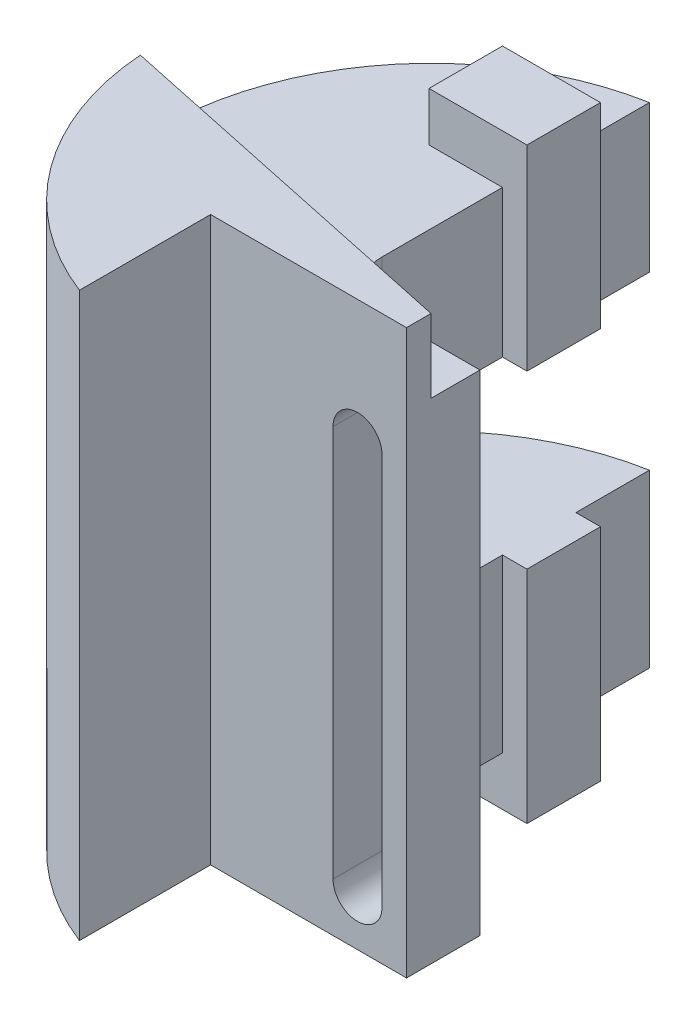
ISO-10303-21;
HEADER;
FILE_DESCRIPTION(('STEP AP214'),'2;1');
FILE_NAME('part.step','',(''),(''),'','','');
FILE_SCHEMA(('AUTOMOTIVE_DESIGN { 1 0 10303 214 1 1 1 1 }'));
ENDSEC;
DATA;
#1=APPLICATION_CONTEXT('core data for automotive mechanical design processes');
#2=APPLICATION_PROTOCOL_DEFINITION('international standard','automotive_design',2000,#1);
#3=PRODUCT_CONTEXT('',#1,'mechanical');
#4=PRODUCT('Part','Part','',(#3));
#5=PRODUCT_RELATED_PRODUCT_CATEGORY('part','',(#4));
#6=PRODUCT_DEFINITION_FORMATION('','',#4);
#7=PRODUCT_DEFINITION_CONTEXT('part definition',#1,'design');
#8=PRODUCT_DEFINITION('design','',#6,#7);
#9=PRODUCT_DEFINITION_SHAPE('','',#8);
#10=(LENGTH_UNIT() NAMED_UNIT(*) SI_UNIT(.MILLI.,.METRE.));
#11=(NAMED_UNIT(*) PLANE_ANGLE_UNIT() SI_UNIT($,.RADIAN.));
#12=(NAMED_UNIT(*) SI_UNIT($,.STERADIAN.) SOLID_ANGLE_UNIT());
#13=UNCERTAINTY_MEASURE_WITH_UNIT(LENGTH_MEASURE(1.E-05),#10,'distance_accuracy_value','');
#14=(GEOMETRIC_REPRESENTATION_CONTEXT(3) GLOBAL_UNCERTAINTY_ASSIGNED_CONTEXT((#13)) GLOBAL_UNIT_ASSIGNED_CONTEXT((#10,
#11,#12)) REPRESENTATION_CONTEXT('',''));
#15=CARTESIAN_POINT('',(0.,0.,0.));
#16=DIRECTION('',(0.,0.,1.));
#17=DIRECTION('',(1.,0.,0.));
#18=AXIS2_PLACEMENT_3D('',#15,#16,#17);
#19=CARTESIAN_POINT('',(0.,0.,0.));
#20=DIRECTION('',(0.,1.,0.));
#21=DIRECTION('',(0.,0.,1.));
#22=AXIS2_PLACEMENT_3D('',#19,#20,#21);
#23=PLANE('',#22);
#24=DIRECTION('',(1.,0.,0.));
#25=VECTOR('',#24,1.);
#26=CARTESIAN_POINT('',(-5.,0.,-39.5916660306315));
#27=LINE('',#26,#25);
#28=CARTESIAN_POINT('',(-25.,0.,-39.5916660306315));
#29=VERTEX_POINT('',#28);
#30=CARTESIAN_POINT('',(-10.,0.,-39.5916660306315));
#31=VERTEX_POINT('',#30);
#32=EDGE_CURVE('E59',#29,#31,#27,.T.);
#33=ORIENTED_EDGE('',*,*,#32,.F.);
#34=DIRECTION('',(0.,0.,-1.));
#35=VECTOR('',#34,1.);
#36=CARTESIAN_POINT('',(-25.,0.,-24.5916660306315));
#37=LINE('',#36,#35);
#38=CARTESIAN_POINT('',(-25.,0.,-24.5916660306315));
#39=VERTEX_POINT('',#38);
#40=EDGE_CURVE('E258',#39,#29,#37,.T.);
#41=ORIENTED_EDGE('',*,*,#40,.F.);
#42=DIRECTION('',(-1.,0.,0.));
#43=VECTOR('',#42,1.);
#44=CARTESIAN_POINT('',(-5.,0.,-24.5916660306315));
#45=LINE('',#44,#43);
#46=CARTESIAN_POINT('',(-10.,0.,-24.5916660306315));
#47=VERTEX_POINT('',#46);
#48=EDGE_CURVE('E11',#47,#39,#45,.T.);
#49=ORIENTED_EDGE('',*,*,#48,.F.);
#50=DIRECTION('',(0.,0.,-1.));
#51=VECTOR('',#50,1.);
#52=CARTESIAN_POINT('',(-10.,0.,-24.5916660306315));
#53=LINE('',#52,#51);
#54=CARTESIAN_POINT('',(-9.99999999999996,0.,0.));
#55=VERTEX_POINT('',#54);
#56=EDGE_CURVE('E382',#55,#47,#53,.T.);
#57=ORIENTED_EDGE('',*,*,#56,.F.);
#58=CARTESIAN_POINT('',(0.,0.,0.));
#59=DIRECTION('',(0.,-1.,0.));
#60=DIRECTION('',(0.,0.,1.));
#61=AXIS2_PLACEMENT_3D('',#58,#59,#60);
#62=CIRCLE('',#61,9.99999999999996);
#63=CARTESIAN_POINT('',(0.,0.,9.99999999999993));
#64=VERTEX_POINT('',#63);
#65=EDGE_CURVE('E406',#64,#55,#62,.T.);
#66=ORIENTED_EDGE('',*,*,#65,.F.);
#67=DIRECTION('',(-1.,0.,0.));
#68=VECTOR('',#67,1.);
#69=CARTESIAN_POINT('',(0.,0.,9.99999999999993));
#70=LINE('',#69,#68);
#71=CARTESIAN_POINT('',(20.,0.,10.));
#72=VERTEX_POINT('',#71);
#73=EDGE_CURVE('E404',#72,#64,#70,.T.);
#74=ORIENTED_EDGE('',*,*,#73,.F.);
#75=DIRECTION('',(0.,0.,-1.));
#76=VECTOR('',#75,1.);
#77=CARTESIAN_POINT('',(20.,0.,10.));
#78=LINE('',#77,#76);
#79=CARTESIAN_POINT('',(20.,0.,25.));
#80=VERTEX_POINT('',#79);
#81=EDGE_CURVE('E402',#80,#72,#78,.T.);
#82=ORIENTED_EDGE('',*,*,#81,.F.);
#83=DIRECTION('',(1.,0.,0.));
#84=VECTOR('',#83,1.);
#85=CARTESIAN_POINT('',(20.,0.,25.));
#86=LINE('',#85,#84);
#87=CARTESIAN_POINT('',(-20.,0.,25.));
#88=VERTEX_POINT('',#87);
#89=EDGE_CURVE('E400',#88,#80,#86,.T.);
#90=ORIENTED_EDGE('',*,*,#89,.F.);
#91=DIRECTION('',(0.,0.,-1.));
#92=VECTOR('',#91,1.);
#93=CARTESIAN_POINT('',(-20.,0.,25.));
#94=LINE('',#93,#92);
#95=CARTESIAN_POINT('',(-20.,0.,51.7711309515255));
#96=VERTEX_POINT('',#95);
#97=EDGE_CURVE('E398',#96,#88,#94,.T.);
#98=ORIENTED_EDGE('',*,*,#97,.F.);
#99=CARTESIAN_POINT('',(0.,0.,0.));
#100=DIRECTION('',(0.,1.,0.));
#101=DIRECTION('',(0.,0.,1.));
#102=AXIS2_PLACEMENT_3D('',#99,#100,#101);
#103=CIRCLE('',#102,55.5);
#104=CARTESIAN_POINT('',(-10.,0.,-54.5916660306315));
#105=VERTEX_POINT('',#104);
#106=EDGE_CURVE('E396',#105,#96,#103,.T.);
#107=ORIENTED_EDGE('',*,*,#106,.F.);
#108=DIRECTION('',(0.,0.,-1.));
#109=VECTOR('',#108,1.);
#110=CARTESIAN_POINT('',(-10.,0.,-54.5916660306315));
#111=LINE('',#110,#109);
#112=EDGE_CURVE('E378',#31,#105,#111,.T.);
#113=ORIENTED_EDGE('',*,*,#112,.F.);
#114=EDGE_LOOP('',(#33,#41,#49,#57,#66,#74,#82,#90,#98,#107,#113));
#115=FACE_BOUND('',#114,.T.);
#116=ADVANCED_FACE('F43',(#115),#23,.F.);
#117=CARTESIAN_POINT('',(0.,100.,0.));
#118=DIRECTION('',(0.,1.,0.));
#119=DIRECTION('',(0.,0.,1.));
#120=AXIS2_PLACEMENT_3D('',#117,#118,#119);
#121=PLANE('',#120);
#122=DIRECTION('',(0.,0.,1.));
#123=VECTOR('',#122,1.);
#124=CARTESIAN_POINT('',(-25.,100.,-39.5916660306315));
#125=LINE('',#124,#123);
#126=CARTESIAN_POINT('',(-25.,100.,-39.5916660306315));
#127=VERTEX_POINT('',#126);
#128=CARTESIAN_POINT('',(-25.,100.,-24.5916660306315));
#129=VERTEX_POINT('',#128);
#130=EDGE_CURVE('E268',#127,#129,#125,.T.);
#131=ORIENTED_EDGE('',*,*,#130,.F.);
#132=DIRECTION('',(1.,0.,0.));
#133=VECTOR('',#132,1.);
#134=CARTESIAN_POINT('',(0.,100.,-39.5916660306315));
#135=LINE('',#134,#133);
#136=CARTESIAN_POINT('',(-10.,100.,-39.5916660306315));
#137=VERTEX_POINT('',#136);
#138=EDGE_CURVE('E47',#127,#137,#135,.T.);
#139=ORIENTED_EDGE('',*,*,#138,.T.);
#140=DIRECTION('',(0.,0.,-1.));
#141=VECTOR('',#140,1.);
#142=CARTESIAN_POINT('',(-10.,100.,-54.5916660306315));
#143=LINE('',#142,#141);
#144=CARTESIAN_POINT('',(-10.,100.,-54.5916660306315));
#145=VERTEX_POINT('',#144);
#146=EDGE_CURVE('E379',#137,#145,#143,.T.);
#147=ORIENTED_EDGE('',*,*,#146,.T.);
#148=CARTESIAN_POINT('',(0.,100.,0.));
#149=DIRECTION('',(0.,1.,0.));
#150=DIRECTION('',(0.,0.,1.));
#151=AXIS2_PLACEMENT_3D('',#148,#149,#150);
#152=CIRCLE('',#151,55.5);
#153=CARTESIAN_POINT('',(-55.3569379835665,100.,3.98238836423228));
#154=VERTEX_POINT('',#153);
#155=EDGE_CURVE('E381',#145,#154,#152,.T.);
#156=ORIENTED_EDGE('',*,*,#155,.T.);
#157=DIRECTION('',(-0.978147600733806,0.,-0.207911690817756));
#158=VECTOR('',#157,1.);
#159=CARTESIAN_POINT('',(20.,100.,20.));
#160=LINE('',#159,#158);
#161=CARTESIAN_POINT('',(20.,100.,20.));
#162=VERTEX_POINT('',#161);
#163=EDGE_CURVE('E324',#162,#154,#160,.T.);
#164=ORIENTED_EDGE('',*,*,#163,.F.);
#165=DIRECTION('',(0.,0.,-1.));
#166=VECTOR('',#165,1.);
#167=CARTESIAN_POINT('',(20.,100.,10.));
#168=LINE('',#167,#166);
#169=CARTESIAN_POINT('',(20.,100.,10.));
#170=VERTEX_POINT('',#169);
#171=EDGE_CURVE('E384',#162,#170,#168,.T.);
#172=ORIENTED_EDGE('',*,*,#171,.T.);
#173=DIRECTION('',(-1.,0.,0.));
#174=VECTOR('',#173,1.);
#175=CARTESIAN_POINT('',(0.,100.,9.99999999999993));
#176=LINE('',#175,#174);
#177=CARTESIAN_POINT('',(0.,100.,9.99999999999993));
#178=VERTEX_POINT('',#177);
#179=EDGE_CURVE('E386',#170,#178,#176,.T.);
#180=ORIENTED_EDGE('',*,*,#179,.T.);
#181=CARTESIAN_POINT('',(0.,100.,0.));
#182=DIRECTION('',(0.,-1.,0.));
#183=DIRECTION('',(0.,0.,1.));
#184=AXIS2_PLACEMENT_3D('',#181,#182,#183);
#185=CIRCLE('',#184,9.99999999999996);
#186=CARTESIAN_POINT('',(-9.99999999999996,100.,0.));
#187=VERTEX_POINT('',#186);
#188=EDGE_CURVE('E388',#178,#187,#185,.T.);
#189=ORIENTED_EDGE('',*,*,#188,.T.);
#190=DIRECTION('',(0.,0.,-1.));
#191=VECTOR('',#190,1.);
#192=CARTESIAN_POINT('',(-10.,100.,-24.5916660306315));
#193=LINE('',#192,#191);
#194=CARTESIAN_POINT('',(-9.99999999999998,100.,-24.5916660306315));
#195=VERTEX_POINT('',#194);
#196=EDGE_CURVE('E390',#187,#195,#193,.T.);
#197=ORIENTED_EDGE('',*,*,#196,.T.);
#198=DIRECTION('',(1.,0.,0.));
#199=VECTOR('',#198,1.);
#200=CARTESIAN_POINT('',(-5.00000000000001,100.,-24.5916660306315));
#201=LINE('',#200,#199);
#202=EDGE_CURVE('E273',#129,#195,#201,.T.);
#203=ORIENTED_EDGE('',*,*,#202,.F.);
#204=EDGE_LOOP('',(#131,#139,#147,#156,#164,#172,#180,#189,#197,#203));
#205=FACE_BOUND('',#204,.T.);
#206=ADVANCED_FACE('F452',(#205),#121,.T.);
#207=CARTESIAN_POINT('',(-10.,100.,-39.5916660306315));
#208=DIRECTION('',(0.,0.,1.));
#209=DIRECTION('',(1.,0.,0.));
#210=AXIS2_PLACEMENT_3D('',#207,#208,#209);
#211=PLANE('',#210);
#212=DIRECTION('',(0.,-1.,0.));
#213=VECTOR('',#212,1.);
#214=CARTESIAN_POINT('',(-10.,100.,-39.5916660306315));
#215=LINE('',#214,#213);
#216=CARTESIAN_POINT('',(-10.,35.,-39.5916660306315));
#217=VERTEX_POINT('',#216);
#218=EDGE_CURVE('E439',#217,#31,#215,.T.);
#219=ORIENTED_EDGE('',*,*,#218,.F.);
#220=DIRECTION('',(1.,0.,0.));
#221=VECTOR('',#220,1.);
#222=CARTESIAN_POINT('',(-10.,35.,-39.5916660306315));
#223=LINE('',#222,#221);
#224=CARTESIAN_POINT('',(-5.00000000000001,35.,-39.5916660306315));
#225=VERTEX_POINT('',#224);
#226=EDGE_CURVE('E318',#217,#225,#223,.T.);
#227=ORIENTED_EDGE('',*,*,#226,.T.);
#228=DIRECTION('',(0.,-1.,0.));
#229=VECTOR('',#228,1.);
#230=CARTESIAN_POINT('',(-5.00000000000001,100.,-39.5916660306315));
#231=LINE('',#230,#229);
#232=CARTESIAN_POINT('',(-5.,-10.,-39.5916660306315));
#233=VERTEX_POINT('',#232);
#234=EDGE_CURVE('E393',#225,#233,#231,.T.);
#235=ORIENTED_EDGE('',*,*,#234,.T.);
#236=DIRECTION('',(1.,0.,0.));
#237=VECTOR('',#236,1.);
#238=CARTESIAN_POINT('',(-5.,-10.,-39.5916660306315));
#239=LINE('',#238,#237);
#240=CARTESIAN_POINT('',(-25.,-10.,-39.5916660306315));
#241=VERTEX_POINT('',#240);
#242=EDGE_CURVE('E256',#241,#233,#239,.T.);
#243=ORIENTED_EDGE('',*,*,#242,.F.);
#244=DIRECTION('',(0.,1.,0.));
#245=VECTOR('',#244,1.);
#246=CARTESIAN_POINT('',(-25.,-10.,-39.5916660306315));
#247=LINE('',#246,#245);
#248=EDGE_CURVE('E262',#241,#29,#247,.T.);
#249=ORIENTED_EDGE('',*,*,#248,.T.);
#250=ORIENTED_EDGE('',*,*,#32,.T.);
#251=EDGE_LOOP('',(#219,#227,#235,#243,#249,#250));
#252=FACE_BOUND('',#251,.T.);
#253=ADVANCED_FACE('F513',(#252),#211,.F.);
#254=CARTESIAN_POINT('',(-10.,100.,-54.5916660306315));
#255=DIRECTION('',(-1.,0.,0.));
#256=DIRECTION('',(0.,0.,1.));
#257=AXIS2_PLACEMENT_3D('',#254,#255,#256);
#258=PLANE('',#257);
#259=DIRECTION('',(0.,-1.,0.));
#260=VECTOR('',#259,1.);
#261=CARTESIAN_POINT('',(-10.,100.,-54.5916660306315));
#262=LINE('',#261,#260);
#263=CARTESIAN_POINT('',(-9.99999999999998,35.,-54.5916660306315));
#264=VERTEX_POINT('',#263);
#265=EDGE_CURVE('E435',#264,#105,#262,.T.);
#266=ORIENTED_EDGE('',*,*,#265,.F.);
#267=DIRECTION('',(0.,0.,1.));
#268=VECTOR('',#267,1.);
#269=CARTESIAN_POINT('',(-10.,35.,-54.5916660306315));
#270=LINE('',#269,#268);
#271=EDGE_CURVE('E315',#264,#217,#270,.T.);
#272=ORIENTED_EDGE('',*,*,#271,.T.);
#273=ORIENTED_EDGE('',*,*,#218,.T.);
#274=ORIENTED_EDGE('',*,*,#112,.T.);
#275=EDGE_LOOP('',(#266,#272,#273,#274));
#276=FACE_BOUND('',#275,.T.);
#277=ADVANCED_FACE('F511',(#276),#258,.F.);
#278=CARTESIAN_POINT('',(-5.,100.,-24.5916660306315));
#279=DIRECTION('',(0.,0.,-1.));
#280=DIRECTION('',(-1.,0.,0.));
#281=AXIS2_PLACEMENT_3D('',#278,#279,#280);
#282=PLANE('',#281);
#283=DIRECTION('',(0.,-1.,0.));
#284=VECTOR('',#283,1.);
#285=CARTESIAN_POINT('',(-5.,100.,-24.5916660306315));
#286=LINE('',#285,#284);
#287=CARTESIAN_POINT('',(-5.,35.,-24.5916660306315));
#288=VERTEX_POINT('',#287);
#289=CARTESIAN_POINT('',(-5.,-10.,-24.5916660306315));
#290=VERTEX_POINT('',#289);
#291=EDGE_CURVE('E232',#288,#290,#286,.T.);
#292=ORIENTED_EDGE('',*,*,#291,.F.);
#293=DIRECTION('',(-1.,0.,0.));
#294=VECTOR('',#293,1.);
#295=CARTESIAN_POINT('',(-5.,35.,-24.5916660306315));
#296=LINE('',#295,#294);
#297=CARTESIAN_POINT('',(-10.,35.,-24.5916660306315));
#298=VERTEX_POINT('',#297);
#299=EDGE_CURVE('E307',#288,#298,#296,.T.);
#300=ORIENTED_EDGE('',*,*,#299,.T.);
#301=DIRECTION('',(0.,-1.,0.));
#302=VECTOR('',#301,1.);
#303=CARTESIAN_POINT('',(-10.,100.,-24.5916660306315));
#304=LINE('',#303,#302);
#305=EDGE_CURVE('E413',#298,#47,#304,.T.);
#306=ORIENTED_EDGE('',*,*,#305,.T.);
#307=ORIENTED_EDGE('',*,*,#48,.T.);
#308=DIRECTION('',(0.,1.,0.));
#309=VECTOR('',#308,1.);
#310=CARTESIAN_POINT('',(-25.,-10.,-24.5916660306315));
#311=LINE('',#310,#309);
#312=CARTESIAN_POINT('',(-25.,-10.,-24.5916660306315));
#313=VERTEX_POINT('',#312);
#314=EDGE_CURVE('E248',#313,#39,#311,.T.);
#315=ORIENTED_EDGE('',*,*,#314,.F.);
#316=DIRECTION('',(-1.,0.,0.));
#317=VECTOR('',#316,1.);
#318=CARTESIAN_POINT('',(-5.,-10.,-24.5916660306315));
#319=LINE('',#318,#317);
#320=EDGE_CURVE('E245',#290,#313,#319,.T.);
#321=ORIENTED_EDGE('',*,*,#320,.F.);
#322=EDGE_LOOP('',(#292,#300,#306,#307,#315,#321));
#323=FACE_BOUND('',#322,.T.);
#324=ADVANCED_FACE('F246',(#323),#282,.F.);
#325=CARTESIAN_POINT('',(-5.00000000000001,100.,-39.5916660306315));
#326=DIRECTION('',(-1.,0.,0.));
#327=DIRECTION('',(0.,0.,1.));
#328=AXIS2_PLACEMENT_3D('',#325,#326,#327);
#329=PLANE('',#328);
#330=ORIENTED_EDGE('',*,*,#234,.F.);
#331=DIRECTION('',(0.,0.,1.));
#332=VECTOR('',#331,1.);
#333=CARTESIAN_POINT('',(-5.00000000000001,35.,-39.5916660306315));
#334=LINE('',#333,#332);
#335=EDGE_CURVE('E238',#225,#288,#334,.T.);
#336=ORIENTED_EDGE('',*,*,#335,.T.);
#337=ORIENTED_EDGE('',*,*,#291,.T.);
#338=DIRECTION('',(0.,0.,1.));
#339=VECTOR('',#338,1.);
#340=CARTESIAN_POINT('',(-5.,-10.,-24.5916660306315));
#341=LINE('',#340,#339);
#342=EDGE_CURVE('E237',#233,#290,#341,.T.);
#343=ORIENTED_EDGE('',*,*,#342,.F.);
#344=EDGE_LOOP('',(#330,#336,#337,#343));
#345=FACE_BOUND('',#344,.T.);
#346=ADVANCED_FACE('F235',(#345),#329,.F.);
#347=CARTESIAN_POINT('',(-5.00000000000001,110.,-39.5916660306315));
#348=VERTEX_POINT('',#347);
#349=CARTESIAN_POINT('',(-5.00000000000001,70.,-39.5916660306315));
#350=VERTEX_POINT('',#349);
#351=EDGE_CURVE('E242',#348,#350,#231,.T.);
#352=ORIENTED_EDGE('',*,*,#351,.T.);
#353=DIRECTION('',(-1.,0.,0.));
#354=VECTOR('',#353,1.);
#355=CARTESIAN_POINT('',(-10.,70.,-39.5916660306315));
#356=LINE('',#355,#354);
#357=CARTESIAN_POINT('',(-10.,70.,-39.5916660306315));
#358=VERTEX_POINT('',#357);
#359=EDGE_CURVE('E304',#350,#358,#356,.T.);
#360=ORIENTED_EDGE('',*,*,#359,.T.);
#361=EDGE_CURVE('E440',#137,#358,#215,.T.);
#362=ORIENTED_EDGE('',*,*,#361,.F.);
#363=ORIENTED_EDGE('',*,*,#138,.F.);
#364=DIRECTION('',(0.,-1.,0.));
#365=VECTOR('',#364,1.);
#366=CARTESIAN_POINT('',(-25.,110.,-39.5916660306315));
#367=LINE('',#366,#365);
#368=CARTESIAN_POINT('',(-25.,110.,-39.5916660306315));
#369=VERTEX_POINT('',#368);
#370=EDGE_CURVE('E283',#369,#127,#367,.T.);
#371=ORIENTED_EDGE('',*,*,#370,.F.);
#372=DIRECTION('',(-1.,0.,0.));
#373=VECTOR('',#372,1.);
#374=CARTESIAN_POINT('',(-5.00000000000001,110.,-39.5916660306315));
#375=LINE('',#374,#373);
#376=EDGE_CURVE('E272',#348,#369,#375,.T.);
#377=ORIENTED_EDGE('',*,*,#376,.F.);
#378=EDGE_LOOP('',(#352,#360,#362,#363,#371,#377));
#379=FACE_BOUND('',#378,.T.);
#380=ADVANCED_FACE('F45',(#379),#211,.F.);
#381=ORIENTED_EDGE('',*,*,#361,.T.);
#382=DIRECTION('',(0.,0.,-1.));
#383=VECTOR('',#382,1.);
#384=CARTESIAN_POINT('',(-10.,70.,-54.5916660306315));
#385=LINE('',#384,#383);
#386=CARTESIAN_POINT('',(-10.,70.,-54.5916660306315));
#387=VERTEX_POINT('',#386);
#388=EDGE_CURVE('E301',#358,#387,#385,.T.);
#389=ORIENTED_EDGE('',*,*,#388,.T.);
#390=EDGE_CURVE('E436',#145,#387,#262,.T.);
#391=ORIENTED_EDGE('',*,*,#390,.F.);
#392=ORIENTED_EDGE('',*,*,#146,.F.);
#393=EDGE_LOOP('',(#381,#389,#391,#392));
#394=FACE_BOUND('',#393,.T.);
#395=ADVANCED_FACE('F459',(#394),#258,.F.);
#396=CARTESIAN_POINT('',(0.,100.,0.));
#397=DIRECTION('',(0.,-1.,0.));
#398=DIRECTION('',(0.,0.,-1.));
#399=AXIS2_PLACEMENT_3D('',#396,#397,#398);
#400=CYLINDRICAL_SURFACE('',#399,55.5);
#401=DIRECTION('',(0.,-1.,0.));
#402=VECTOR('',#401,1.);
#403=CARTESIAN_POINT('',(-53.5474862383895,100.,-14.5916660306314));
#404=LINE('',#403,#402);
#405=CARTESIAN_POINT('',(-53.5474862383895,70.,-14.5916660306315));
#406=VERTEX_POINT('',#405);
#407=CARTESIAN_POINT('',(-53.5474862383895,35.,-14.5916660306315));
#408=VERTEX_POINT('',#407);
#409=EDGE_CURVE('E321',#406,#408,#404,.T.);
#410=ORIENTED_EDGE('',*,*,#409,.T.);
#411=CARTESIAN_POINT('',(0.,35.,0.));
#412=DIRECTION('',(0.,-1.,0.));
#413=DIRECTION('',(0.,0.,-1.));
#414=AXIS2_PLACEMENT_3D('',#411,#412,#413);
#415=CIRCLE('',#414,55.5);
#416=EDGE_CURVE('E312',#408,#264,#415,.T.);
#417=ORIENTED_EDGE('',*,*,#416,.T.);
#418=ORIENTED_EDGE('',*,*,#265,.T.);
#419=ORIENTED_EDGE('',*,*,#106,.T.);
#420=DIRECTION('',(0.,-1.,0.));
#421=VECTOR('',#420,1.);
#422=CARTESIAN_POINT('',(-20.,100.,51.7711309515255));
#423=LINE('',#422,#421);
#424=CARTESIAN_POINT('',(-20.,115.,51.7711309515255));
#425=VERTEX_POINT('',#424);
#426=EDGE_CURVE('E432',#425,#96,#423,.T.);
#427=ORIENTED_EDGE('',*,*,#426,.F.);
#428=CARTESIAN_POINT('',(0.,115.,0.));
#429=DIRECTION('',(0.,1.,0.));
#430=DIRECTION('',(0.,0.,1.));
#431=AXIS2_PLACEMENT_3D('',#428,#429,#430);
#432=CIRCLE('',#431,55.5);
#433=CARTESIAN_POINT('',(-55.3569379835665,115.,3.98238836423228));
#434=VERTEX_POINT('',#433);
#435=EDGE_CURVE('E332',#434,#425,#432,.T.);
#436=ORIENTED_EDGE('',*,*,#435,.F.);
#437=DIRECTION('',(0.,-1.,0.));
#438=VECTOR('',#437,1.);
#439=CARTESIAN_POINT('',(-55.3569379835665,115.,3.98238836423228));
#440=LINE('',#439,#438);
#441=EDGE_CURVE('E338',#434,#154,#440,.T.);
#442=ORIENTED_EDGE('',*,*,#441,.T.);
#443=ORIENTED_EDGE('',*,*,#155,.F.);
#444=ORIENTED_EDGE('',*,*,#390,.T.);
#445=CARTESIAN_POINT('',(0.,70.,0.));
#446=DIRECTION('',(0.,1.,0.));
#447=DIRECTION('',(0.,0.,1.));
#448=AXIS2_PLACEMENT_3D('',#445,#446,#447);
#449=CIRCLE('',#448,55.5);
#450=EDGE_CURVE('E298',#387,#406,#449,.T.);
#451=ORIENTED_EDGE('',*,*,#450,.T.);
#452=EDGE_LOOP('',(#410,#417,#418,#419,#427,#436,#442,#443,#444,#451));
#453=FACE_BOUND('',#452,.T.);
#454=ADVANCED_FACE('F482',(#453),#400,.T.);
#455=CARTESIAN_POINT('',(-20.,100.,25.));
#456=DIRECTION('',(-1.,0.,0.));
#457=DIRECTION('',(0.,0.,1.));
#458=AXIS2_PLACEMENT_3D('',#455,#456,#457);
#459=PLANE('',#458);
#460=ORIENTED_EDGE('',*,*,#97,.T.);
#461=DIRECTION('',(0.,-1.,0.));
#462=VECTOR('',#461,1.);
#463=CARTESIAN_POINT('',(-20.,100.,25.));
#464=LINE('',#463,#462);
#465=CARTESIAN_POINT('',(-20.,115.,25.));
#466=VERTEX_POINT('',#465);
#467=EDGE_CURVE('E429',#466,#88,#464,.T.);
#468=ORIENTED_EDGE('',*,*,#467,.F.);
#469=DIRECTION('',(0.,0.,-1.));
#470=VECTOR('',#469,1.);
#471=CARTESIAN_POINT('',(-20.,115.,51.7711309515255));
#472=LINE('',#471,#470);
#473=EDGE_CURVE('E335',#425,#466,#472,.T.);
#474=ORIENTED_EDGE('',*,*,#473,.F.);
#475=ORIENTED_EDGE('',*,*,#426,.T.);
#476=EDGE_LOOP('',(#460,#468,#474,#475));
#477=FACE_BOUND('',#476,.T.);
#478=ADVANCED_FACE('F551',(#477),#459,.F.);
#479=CARTESIAN_POINT('',(20.,100.,25.));
#480=DIRECTION('',(0.,0.,-1.));
#481=DIRECTION('',(-1.,0.,0.));
#482=AXIS2_PLACEMENT_3D('',#479,#480,#481);
#483=PLANE('',#482);
#484=DIRECTION('',(0.,1.,0.));
#485=VECTOR('',#484,1.);
#486=CARTESIAN_POINT('',(4.99999999999996,100.,25.));
#487=LINE('',#486,#485);
#488=CARTESIAN_POINT('',(4.99999999999994,10.0035556361425,25.));
#489=VERTEX_POINT('',#488);
#490=CARTESIAN_POINT('',(4.99999999999995,90.0035556361425,25.));
#491=VERTEX_POINT('',#490);
#492=EDGE_CURVE('E372',#489,#491,#487,.T.);
#493=ORIENTED_EDGE('',*,*,#492,.T.);
#494=CARTESIAN_POINT('',(9.99999999999995,90.0035556361425,25.));
#495=DIRECTION('',(0.,0.,-1.));
#496=DIRECTION('',(-1.,0.,0.));
#497=AXIS2_PLACEMENT_3D('',#494,#495,#496);
#498=CIRCLE('',#497,5.);
#499=CARTESIAN_POINT('',(15.,90.0035556361425,25.));
#500=VERTEX_POINT('',#499);
#501=EDGE_CURVE('E375',#491,#500,#498,.T.);
#502=ORIENTED_EDGE('',*,*,#501,.T.);
#503=DIRECTION('',(0.,-1.,0.));
#504=VECTOR('',#503,1.);
#505=CARTESIAN_POINT('',(15.,100.,25.));
#506=LINE('',#505,#504);
#507=CARTESIAN_POINT('',(14.9999999999999,10.0035556361425,25.));
#508=VERTEX_POINT('',#507);
#509=EDGE_CURVE('E360',#500,#508,#506,.T.);
#510=ORIENTED_EDGE('',*,*,#509,.T.);
#511=CARTESIAN_POINT('',(9.99999999999994,10.0035556361425,25.));
#512=DIRECTION('',(0.,0.,-1.));
#513=DIRECTION('',(-1.,0.,0.));
#514=AXIS2_PLACEMENT_3D('',#511,#512,#513);
#515=CIRCLE('',#514,5.);
#516=EDGE_CURVE('E369',#508,#489,#515,.T.);
#517=ORIENTED_EDGE('',*,*,#516,.T.);
#518=EDGE_LOOP('',(#493,#502,#510,#517));
#519=FACE_BOUND('',#518,.T.);
#520=ORIENTED_EDGE('',*,*,#89,.T.);
#521=DIRECTION('',(0.,-1.,0.));
#522=VECTOR('',#521,1.);
#523=CARTESIAN_POINT('',(20.,100.,25.));
#524=LINE('',#523,#522);
#525=CARTESIAN_POINT('',(20.,115.,25.));
#526=VERTEX_POINT('',#525);
#527=EDGE_CURVE('E426',#526,#80,#524,.T.);
#528=ORIENTED_EDGE('',*,*,#527,.F.);
#529=DIRECTION('',(1.,0.,0.));
#530=VECTOR('',#529,1.);
#531=CARTESIAN_POINT('',(-20.,115.,25.));
#532=LINE('',#531,#530);
#533=EDGE_CURVE('E325',#466,#526,#532,.T.);
#534=ORIENTED_EDGE('',*,*,#533,.F.);
#535=ORIENTED_EDGE('',*,*,#467,.T.);
#536=EDGE_LOOP('',(#520,#528,#534,#535));
#537=FACE_BOUND('',#536,.T.);
#538=ADVANCED_FACE('F548',(#519,#537),#483,.F.);
#539=CARTESIAN_POINT('',(20.,100.,10.));
#540=DIRECTION('',(-1.,0.,0.));
#541=DIRECTION('',(0.,0.,1.));
#542=AXIS2_PLACEMENT_3D('',#539,#540,#541);
#543=PLANE('',#542);
#544=ORIENTED_EDGE('',*,*,#81,.T.);
#545=DIRECTION('',(0.,-1.,0.));
#546=VECTOR('',#545,1.);
#547=CARTESIAN_POINT('',(20.,100.,10.));
#548=LINE('',#547,#546);
#549=EDGE_CURVE('E423',#170,#72,#548,.T.);
#550=ORIENTED_EDGE('',*,*,#549,.F.);
#551=ORIENTED_EDGE('',*,*,#171,.F.);
#552=DIRECTION('',(0.,-1.,0.));
#553=VECTOR('',#552,1.);
#554=CARTESIAN_POINT('',(20.,115.,20.));
#555=LINE('',#554,#553);
#556=CARTESIAN_POINT('',(20.,115.,20.));
#557=VERTEX_POINT('',#556);
#558=EDGE_CURVE('E343',#557,#162,#555,.T.);
#559=ORIENTED_EDGE('',*,*,#558,.F.);
#560=DIRECTION('',(0.,0.,-1.));
#561=VECTOR('',#560,1.);
#562=CARTESIAN_POINT('',(20.,115.,25.));
#563=LINE('',#562,#561);
#564=EDGE_CURVE('E328',#526,#557,#563,.T.);
#565=ORIENTED_EDGE('',*,*,#564,.F.);
#566=ORIENTED_EDGE('',*,*,#527,.T.);
#567=EDGE_LOOP('',(#544,#550,#551,#559,#565,#566));
#568=FACE_BOUND('',#567,.T.);
#569=ADVANCED_FACE('F493',(#568),#543,.F.);
#570=CARTESIAN_POINT('',(0.,100.,9.99999999999993));
#571=DIRECTION('',(0.,0.,1.));
#572=DIRECTION('',(1.,0.,0.));
#573=AXIS2_PLACEMENT_3D('',#570,#571,#572);
#574=PLANE('',#573);
#575=DIRECTION('',(0.,-1.,0.));
#576=VECTOR('',#575,1.);
#577=CARTESIAN_POINT('',(15.,90.0035556361425,9.99999999999998));
#578=LINE('',#577,#576);
#579=CARTESIAN_POINT('',(15.,90.0035556361425,9.99999999999998));
#580=VERTEX_POINT('',#579);
#581=CARTESIAN_POINT('',(15.,10.0035556361425,9.99999999999998));
#582=VERTEX_POINT('',#581);
#583=EDGE_CURVE('E348',#580,#582,#578,.T.);
#584=ORIENTED_EDGE('',*,*,#583,.F.);
#585=CARTESIAN_POINT('',(10.,90.0035556361425,9.99999999999996));
#586=DIRECTION('',(0.,0.,-1.));
#587=DIRECTION('',(-1.,0.,0.));
#588=AXIS2_PLACEMENT_3D('',#585,#586,#587);
#589=CIRCLE('',#588,5.);
#590=CARTESIAN_POINT('',(5.00000000000001,90.0035556361425,9.99999999999994));
#591=VERTEX_POINT('',#590);
#592=EDGE_CURVE('E346',#591,#580,#589,.T.);
#593=ORIENTED_EDGE('',*,*,#592,.F.);
#594=DIRECTION('',(0.,1.,0.));
#595=VECTOR('',#594,1.);
#596=CARTESIAN_POINT('',(5.00000000000001,90.0035556361425,9.99999999999994));
#597=LINE('',#596,#595);
#598=CARTESIAN_POINT('',(5.,10.0035556361425,9.99999999999994));
#599=VERTEX_POINT('',#598);
#600=EDGE_CURVE('E354',#599,#591,#597,.T.);
#601=ORIENTED_EDGE('',*,*,#600,.F.);
#602=CARTESIAN_POINT('',(10.,10.0035556361425,9.99999999999996));
#603=DIRECTION('',(0.,0.,-1.));
#604=DIRECTION('',(-1.,0.,0.));
#605=AXIS2_PLACEMENT_3D('',#602,#603,#604);
#606=CIRCLE('',#605,5.);
#607=EDGE_CURVE('E351',#582,#599,#606,.T.);
#608=ORIENTED_EDGE('',*,*,#607,.F.);
#609=EDGE_LOOP('',(#584,#593,#601,#608));
#610=FACE_BOUND('',#609,.T.);
#611=ORIENTED_EDGE('',*,*,#73,.T.);
#612=DIRECTION('',(0.,-1.,0.));
#613=VECTOR('',#612,1.);
#614=CARTESIAN_POINT('',(0.,100.,9.99999999999993));
#615=LINE('',#614,#613);
#616=EDGE_CURVE('E420',#178,#64,#615,.T.);
#617=ORIENTED_EDGE('',*,*,#616,.F.);
#618=ORIENTED_EDGE('',*,*,#179,.F.);
#619=ORIENTED_EDGE('',*,*,#549,.T.);
#620=EDGE_LOOP('',(#611,#617,#618,#619));
#621=FACE_BOUND('',#620,.T.);
#622=ADVANCED_FACE('F500',(#610,#621),#574,.F.);
#623=CARTESIAN_POINT('',(0.,100.,0.));
#624=DIRECTION('',(0.,-1.,0.));
#625=DIRECTION('',(0.,0.,-1.));
#626=AXIS2_PLACEMENT_3D('',#623,#624,#625);
#627=CYLINDRICAL_SURFACE('',#626,9.99999999999996);
#628=ORIENTED_EDGE('',*,*,#65,.T.);
#629=DIRECTION('',(0.,-1.,0.));
#630=VECTOR('',#629,1.);
#631=CARTESIAN_POINT('',(-9.99999999999996,100.,0.));
#632=LINE('',#631,#630);
#633=EDGE_CURVE('E417',#187,#55,#632,.T.);
#634=ORIENTED_EDGE('',*,*,#633,.F.);
#635=ORIENTED_EDGE('',*,*,#188,.F.);
#636=ORIENTED_EDGE('',*,*,#616,.T.);
#637=EDGE_LOOP('',(#628,#634,#635,#636));
#638=FACE_BOUND('',#637,.T.);
#639=ADVANCED_FACE('F504',(#638),#627,.F.);
#640=CARTESIAN_POINT('',(-10.,100.,-24.5916660306315));
#641=DIRECTION('',(-1.,0.,0.));
#642=DIRECTION('',(0.,0.,1.));
#643=AXIS2_PLACEMENT_3D('',#640,#641,#642);
#644=PLANE('',#643);
#645=ORIENTED_EDGE('',*,*,#305,.F.);
#646=DIRECTION('',(0.,0.,1.));
#647=VECTOR('',#646,1.);
#648=CARTESIAN_POINT('',(-10.,35.,-24.5916660306315));
#649=LINE('',#648,#647);
#650=CARTESIAN_POINT('',(-10.,35.,-14.5916660306315));
#651=VERTEX_POINT('',#650);
#652=EDGE_CURVE('E309',#298,#651,#649,.T.);
#653=ORIENTED_EDGE('',*,*,#652,.T.);
#654=DIRECTION('',(0.,1.,0.));
#655=VECTOR('',#654,1.);
#656=CARTESIAN_POINT('',(-10.,100.,-14.5916660306315));
#657=LINE('',#656,#655);
#658=CARTESIAN_POINT('',(-10.,70.,-14.5916660306315));
#659=VERTEX_POINT('',#658);
#660=EDGE_CURVE('E446',#651,#659,#657,.T.);
#661=ORIENTED_EDGE('',*,*,#660,.T.);
#662=DIRECTION('',(0.,0.,-1.));
#663=VECTOR('',#662,1.);
#664=CARTESIAN_POINT('',(-10.,70.,-24.5916660306315));
#665=LINE('',#664,#663);
#666=CARTESIAN_POINT('',(-10.,70.,-24.5916660306315));
#667=VERTEX_POINT('',#666);
#668=EDGE_CURVE('E295',#659,#667,#665,.T.);
#669=ORIENTED_EDGE('',*,*,#668,.T.);
#670=EDGE_CURVE('E414',#195,#667,#304,.T.);
#671=ORIENTED_EDGE('',*,*,#670,.F.);
#672=ORIENTED_EDGE('',*,*,#196,.F.);
#673=ORIENTED_EDGE('',*,*,#633,.T.);
#674=ORIENTED_EDGE('',*,*,#56,.T.);
#675=EDGE_LOOP('',(#645,#653,#661,#669,#671,#672,#673,#674));
#676=FACE_BOUND('',#675,.T.);
#677=ADVANCED_FACE('F476',(#676),#644,.F.);
#678=ORIENTED_EDGE('',*,*,#670,.T.);
#679=DIRECTION('',(1.,0.,0.));
#680=VECTOR('',#679,1.);
#681=CARTESIAN_POINT('',(-5.,70.,-24.5916660306315));
#682=LINE('',#681,#680);
#683=CARTESIAN_POINT('',(-5.,70.,-24.5916660306315));
#684=VERTEX_POINT('',#683);
#685=EDGE_CURVE('E290',#667,#684,#682,.T.);
#686=ORIENTED_EDGE('',*,*,#685,.T.);
#687=CARTESIAN_POINT('',(-5.00000000000001,110.,-24.5916660306315));
#688=VERTEX_POINT('',#687);
#689=EDGE_CURVE('E241',#688,#684,#286,.T.);
#690=ORIENTED_EDGE('',*,*,#689,.F.);
#691=DIRECTION('',(1.,0.,0.));
#692=VECTOR('',#691,1.);
#693=CARTESIAN_POINT('',(-5.00000000000001,110.,-24.5916660306315));
#694=LINE('',#693,#692);
#695=CARTESIAN_POINT('',(-25.,110.,-24.5916660306315));
#696=VERTEX_POINT('',#695);
#697=EDGE_CURVE('E277',#696,#688,#694,.T.);
#698=ORIENTED_EDGE('',*,*,#697,.F.);
#699=DIRECTION('',(0.,-1.,0.));
#700=VECTOR('',#699,1.);
#701=CARTESIAN_POINT('',(-25.,110.,-24.5916660306315));
#702=LINE('',#701,#700);
#703=EDGE_CURVE('E67',#696,#129,#702,.T.);
#704=ORIENTED_EDGE('',*,*,#703,.T.);
#705=ORIENTED_EDGE('',*,*,#202,.T.);
#706=EDGE_LOOP('',(#678,#686,#690,#698,#704,#705));
#707=FACE_BOUND('',#706,.T.);
#708=ADVANCED_FACE('F467',(#707),#282,.F.);
#709=ORIENTED_EDGE('',*,*,#689,.T.);
#710=DIRECTION('',(0.,0.,-1.));
#711=VECTOR('',#710,1.);
#712=CARTESIAN_POINT('',(-5.00000000000001,70.,-39.5916660306315));
#713=LINE('',#712,#711);
#714=EDGE_CURVE('E443',#684,#350,#713,.T.);
#715=ORIENTED_EDGE('',*,*,#714,.T.);
#716=ORIENTED_EDGE('',*,*,#351,.F.);
#717=DIRECTION('',(0.,0.,-1.));
#718=VECTOR('',#717,1.);
#719=CARTESIAN_POINT('',(-5.00000000000001,110.,-39.5916660306315));
#720=LINE('',#719,#718);
#721=EDGE_CURVE('E269',#688,#348,#720,.T.);
#722=ORIENTED_EDGE('',*,*,#721,.F.);
#723=EDGE_LOOP('',(#709,#715,#716,#722));
#724=FACE_BOUND('',#723,.T.);
#725=ADVANCED_FACE('F465',(#724),#329,.F.);
#726=CARTESIAN_POINT('',(9.99999999999963,90.0035556361425,110.));
#727=DIRECTION('',(0.,0.,-1.));
#728=DIRECTION('',(-1.,0.,0.));
#729=AXIS2_PLACEMENT_3D('',#726,#727,#728);
#730=CYLINDRICAL_SURFACE('',#729,5.);
#731=DIRECTION('',(0.,0.,-1.));
#732=VECTOR('',#731,1.);
#733=CARTESIAN_POINT('',(4.99999999999963,90.0035556361425,110.));
#734=LINE('',#733,#732);
#735=EDGE_CURVE('E358',#491,#591,#734,.T.);
#736=ORIENTED_EDGE('',*,*,#735,.T.);
#737=ORIENTED_EDGE('',*,*,#592,.T.);
#738=DIRECTION('',(0.,0.,-1.));
#739=VECTOR('',#738,1.);
#740=CARTESIAN_POINT('',(14.9999999999996,90.0035556361425,110.));
#741=LINE('',#740,#739);
#742=EDGE_CURVE('E357',#500,#580,#741,.T.);
#743=ORIENTED_EDGE('',*,*,#742,.F.);
#744=ORIENTED_EDGE('',*,*,#501,.F.);
#745=EDGE_LOOP('',(#736,#737,#743,#744));
#746=FACE_BOUND('',#745,.T.);
#747=ADVANCED_FACE('F537',(#746),#730,.F.);
#748=CARTESIAN_POINT('',(4.99999999999963,90.0035556361425,110.));
#749=DIRECTION('',(-1.,0.,0.));
#750=DIRECTION('',(0.,0.,1.));
#751=AXIS2_PLACEMENT_3D('',#748,#749,#750);
#752=PLANE('',#751);
#753=DIRECTION('',(0.,0.,-1.));
#754=VECTOR('',#753,1.);
#755=CARTESIAN_POINT('',(4.99999999999962,10.0035556361425,110.));
#756=LINE('',#755,#754);
#757=EDGE_CURVE('E361',#489,#599,#756,.T.);
#758=ORIENTED_EDGE('',*,*,#757,.T.);
#759=ORIENTED_EDGE('',*,*,#600,.T.);
#760=ORIENTED_EDGE('',*,*,#735,.F.);
#761=ORIENTED_EDGE('',*,*,#492,.F.);
#762=EDGE_LOOP('',(#758,#759,#760,#761));
#763=FACE_BOUND('',#762,.T.);
#764=ADVANCED_FACE('F721',(#763),#752,.F.);
#765=CARTESIAN_POINT('',(9.99999999999962,10.0035556361425,110.));
#766=DIRECTION('',(0.,0.,-1.));
#767=DIRECTION('',(-1.,0.,0.));
#768=AXIS2_PLACEMENT_3D('',#765,#766,#767);
#769=CYLINDRICAL_SURFACE('',#768,5.);
#770=DIRECTION('',(0.,0.,-1.));
#771=VECTOR('',#770,1.);
#772=CARTESIAN_POINT('',(14.9999999999996,10.0035556361425,110.));
#773=LINE('',#772,#771);
#774=EDGE_CURVE('E363',#508,#582,#773,.T.);
#775=ORIENTED_EDGE('',*,*,#774,.T.);
#776=ORIENTED_EDGE('',*,*,#607,.T.);
#777=ORIENTED_EDGE('',*,*,#757,.F.);
#778=ORIENTED_EDGE('',*,*,#516,.F.);
#779=EDGE_LOOP('',(#775,#776,#777,#778));
#780=FACE_BOUND('',#779,.T.);
#781=ADVANCED_FACE('F711',(#780),#769,.F.);
#782=CARTESIAN_POINT('',(14.9999999999996,90.0035556361425,110.));
#783=DIRECTION('',(1.,0.,0.));
#784=DIRECTION('',(0.,0.,-1.));
#785=AXIS2_PLACEMENT_3D('',#782,#783,#784);
#786=PLANE('',#785);
#787=ORIENTED_EDGE('',*,*,#742,.T.);
#788=ORIENTED_EDGE('',*,*,#583,.T.);
#789=ORIENTED_EDGE('',*,*,#774,.F.);
#790=ORIENTED_EDGE('',*,*,#509,.F.);
#791=EDGE_LOOP('',(#787,#788,#789,#790));
#792=FACE_BOUND('',#791,.T.);
#793=ADVANCED_FACE('F669',(#792),#786,.F.);
#794=CARTESIAN_POINT('',(20.,115.,20.));
#795=DIRECTION('',(-0.207911690817756,0.,0.978147600733806));
#796=DIRECTION('',(0.978147600733806,0.,0.207911690817756));
#797=AXIS2_PLACEMENT_3D('',#794,#795,#796);
#798=PLANE('',#797);
#799=ORIENTED_EDGE('',*,*,#163,.T.);
#800=ORIENTED_EDGE('',*,*,#441,.F.);
#801=DIRECTION('',(-0.978147600733806,0.,-0.207911690817756));
#802=VECTOR('',#801,1.);
#803=CARTESIAN_POINT('',(20.,115.,20.));
#804=LINE('',#803,#802);
#805=EDGE_CURVE('E330',#557,#434,#804,.T.);
#806=ORIENTED_EDGE('',*,*,#805,.F.);
#807=ORIENTED_EDGE('',*,*,#558,.T.);
#808=EDGE_LOOP('',(#799,#800,#806,#807));
#809=FACE_BOUND('',#808,.T.);
#810=ADVANCED_FACE('F488',(#809),#798,.F.);
#811=CARTESIAN_POINT('',(0.,115.,0.));
#812=DIRECTION('',(0.,1.,0.));
#813=DIRECTION('',(0.,0.,1.));
#814=AXIS2_PLACEMENT_3D('',#811,#812,#813);
#815=PLANE('',#814);
#816=ORIENTED_EDGE('',*,*,#533,.T.);
#817=ORIENTED_EDGE('',*,*,#564,.T.);
#818=ORIENTED_EDGE('',*,*,#805,.T.);
#819=ORIENTED_EDGE('',*,*,#435,.T.);
#820=ORIENTED_EDGE('',*,*,#473,.T.);
#821=EDGE_LOOP('',(#816,#817,#818,#819,#820));
#822=FACE_BOUND('',#821,.T.);
#823=ADVANCED_FACE('F640',(#822),#815,.T.);
#824=CARTESIAN_POINT('',(-55.5,70.,-14.5916660306315));
#825=DIRECTION('',(0.,0.,1.));
#826=DIRECTION('',(0.,-1.,0.));
#827=AXIS2_PLACEMENT_3D('',#824,#825,#826);
#828=PLANE('',#827);
#829=DIRECTION('',(1.,0.,0.));
#830=VECTOR('',#829,1.);
#831=CARTESIAN_POINT('',(-55.5,70.,-14.5916660306315));
#832=LINE('',#831,#830);
#833=EDGE_CURVE('E286',#406,#659,#832,.T.);
#834=ORIENTED_EDGE('',*,*,#833,.T.);
#835=ORIENTED_EDGE('',*,*,#660,.F.);
#836=DIRECTION('',(1.,0.,0.));
#837=VECTOR('',#836,1.);
#838=CARTESIAN_POINT('',(-55.5,35.,-14.5916660306315));
#839=LINE('',#838,#837);
#840=EDGE_CURVE('E287',#408,#651,#839,.T.);
#841=ORIENTED_EDGE('',*,*,#840,.F.);
#842=ORIENTED_EDGE('',*,*,#409,.F.);
#843=EDGE_LOOP('',(#834,#835,#841,#842));
#844=FACE_BOUND('',#843,.T.);
#845=ADVANCED_FACE('F479',(#844),#828,.F.);
#846=CARTESIAN_POINT('',(-55.5,35.,-54.5916660306315));
#847=DIRECTION('',(0.,-1.,0.));
#848=DIRECTION('',(0.,0.,-1.));
#849=AXIS2_PLACEMENT_3D('',#846,#847,#848);
#850=PLANE('',#849);
#851=ORIENTED_EDGE('',*,*,#271,.F.);
#852=ORIENTED_EDGE('',*,*,#416,.F.);
#853=ORIENTED_EDGE('',*,*,#840,.T.);
#854=ORIENTED_EDGE('',*,*,#652,.F.);
#855=ORIENTED_EDGE('',*,*,#299,.F.);
#856=ORIENTED_EDGE('',*,*,#335,.F.);
#857=ORIENTED_EDGE('',*,*,#226,.F.);
#858=EDGE_LOOP('',(#851,#852,#853,#854,#855,#856,#857));
#859=FACE_BOUND('',#858,.T.);
#860=ADVANCED_FACE('F508',(#859),#850,.F.);
#861=CARTESIAN_POINT('',(-55.5,70.,-54.5916660306314));
#862=DIRECTION('',(0.,1.,0.));
#863=DIRECTION('',(0.,0.,1.));
#864=AXIS2_PLACEMENT_3D('',#861,#862,#863);
#865=PLANE('',#864);
#866=ORIENTED_EDGE('',*,*,#714,.F.);
#867=ORIENTED_EDGE('',*,*,#685,.F.);
#868=ORIENTED_EDGE('',*,*,#668,.F.);
#869=ORIENTED_EDGE('',*,*,#833,.F.);
#870=ORIENTED_EDGE('',*,*,#450,.F.);
#871=ORIENTED_EDGE('',*,*,#388,.F.);
#872=ORIENTED_EDGE('',*,*,#359,.F.);
#873=EDGE_LOOP('',(#866,#867,#868,#869,#870,#871,#872));
#874=FACE_BOUND('',#873,.T.);
#875=ADVANCED_FACE('F463',(#874),#865,.F.);
#876=CARTESIAN_POINT('',(-25.,110.,-39.5916660306315));
#877=DIRECTION('',(1.,0.,0.));
#878=DIRECTION('',(0.,0.,-1.));
#879=AXIS2_PLACEMENT_3D('',#876,#877,#878);
#880=PLANE('',#879);
#881=ORIENTED_EDGE('',*,*,#130,.T.);
#882=ORIENTED_EDGE('',*,*,#703,.F.);
#883=DIRECTION('',(0.,0.,1.));
#884=VECTOR('',#883,1.);
#885=CARTESIAN_POINT('',(-25.,110.,-39.5916660306315));
#886=LINE('',#885,#884);
#887=EDGE_CURVE('E275',#369,#696,#886,.T.);
#888=ORIENTED_EDGE('',*,*,#887,.F.);
#889=ORIENTED_EDGE('',*,*,#370,.T.);
#890=EDGE_LOOP('',(#881,#882,#888,#889));
#891=FACE_BOUND('',#890,.T.);
#892=ADVANCED_FACE('F472',(#891),#880,.F.);
#893=CARTESIAN_POINT('',(0.,110.,0.));
#894=DIRECTION('',(0.,-1.,0.));
#895=DIRECTION('',(0.,0.,-1.));
#896=AXIS2_PLACEMENT_3D('',#893,#894,#895);
#897=PLANE('',#896);
#898=ORIENTED_EDGE('',*,*,#721,.T.);
#899=ORIENTED_EDGE('',*,*,#376,.T.);
#900=ORIENTED_EDGE('',*,*,#887,.T.);
#901=ORIENTED_EDGE('',*,*,#697,.T.);
#902=EDGE_LOOP('',(#898,#899,#900,#901));
#903=FACE_BOUND('',#902,.T.);
#904=ADVANCED_FACE('F469',(#903),#897,.F.);
#905=CARTESIAN_POINT('',(-25.,-10.,-24.5916660306315));
#906=DIRECTION('',(1.,0.,0.));
#907=DIRECTION('',(0.,0.,-1.));
#908=AXIS2_PLACEMENT_3D('',#905,#906,#907);
#909=PLANE('',#908);
#910=ORIENTED_EDGE('',*,*,#40,.T.);
#911=ORIENTED_EDGE('',*,*,#248,.F.);
#912=DIRECTION('',(0.,0.,-1.));
#913=VECTOR('',#912,1.);
#914=CARTESIAN_POINT('',(-25.,-10.,-24.5916660306315));
#915=LINE('',#914,#913);
#916=EDGE_CURVE('E251',#313,#241,#915,.T.);
#917=ORIENTED_EDGE('',*,*,#916,.F.);
#918=ORIENTED_EDGE('',*,*,#314,.T.);
#919=EDGE_LOOP('',(#910,#911,#917,#918));
#920=FACE_BOUND('',#919,.T.);
#921=ADVANCED_FACE('F516',(#920),#909,.F.);
#922=CARTESIAN_POINT('',(0.,-10.,0.));
#923=DIRECTION('',(0.,1.,0.));
#924=DIRECTION('',(0.,0.,1.));
#925=AXIS2_PLACEMENT_3D('',#922,#923,#924);
#926=PLANE('',#925);
#927=ORIENTED_EDGE('',*,*,#342,.T.);
#928=ORIENTED_EDGE('',*,*,#320,.T.);
#929=ORIENTED_EDGE('',*,*,#916,.T.);
#930=ORIENTED_EDGE('',*,*,#242,.T.);
#931=EDGE_LOOP('',(#927,#928,#929,#930));
#932=FACE_BOUND('',#931,.T.);
#933=ADVANCED_FACE('F254',(#932),#926,.F.);
#934=CLOSED_SHELL('',(#116,#206,#253,#277,#324,#346,#380,#395,#454,#478,#538,#569,#622,#639,
#677,#708,#725,#747,#764,#781,#793,#810,#823,#845,#860,#875,#892,#904,#921,#933));
#935=MANIFOLD_SOLID_BREP('B2',#934);
#936=ADVANCED_BREP_SHAPE_REPRESENTATION('',(#18,#935),#14);
#937=SHAPE_DEFINITION_REPRESENTATION(#9,#936);
ENDSEC;
END-ISO-10303-21;
